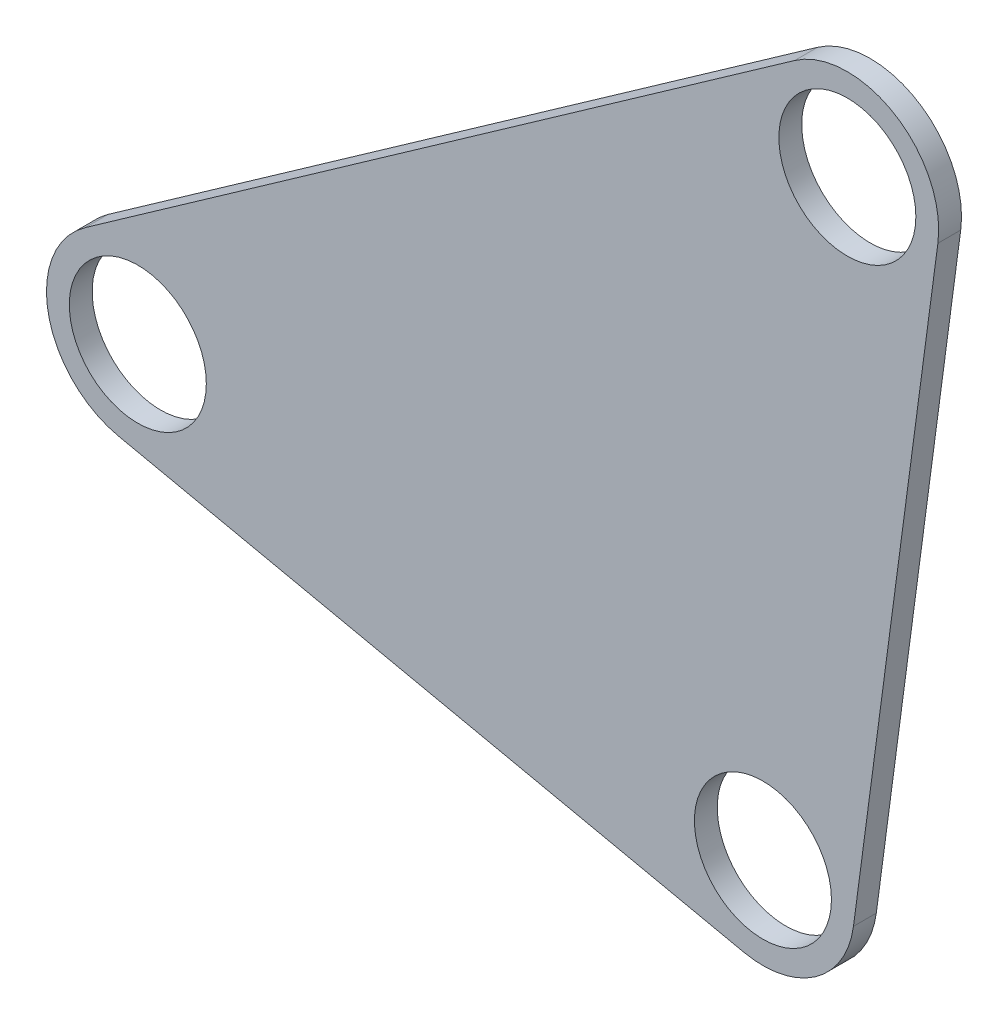
ISO-10303-21;
HEADER;
FILE_DESCRIPTION(('STEP AP214'),'2;1');
FILE_NAME('part.step','',(''),(''),'','','');
FILE_SCHEMA(('AUTOMOTIVE_DESIGN { 1 0 10303 214 1 1 1 1 }'));
ENDSEC;
DATA;
#1=APPLICATION_CONTEXT('core data for automotive mechanical design processes');
#2=APPLICATION_PROTOCOL_DEFINITION('international standard','automotive_design',2000,#1);
#3=PRODUCT_CONTEXT('',#1,'mechanical');
#4=PRODUCT('Part','Part','',(#3));
#5=PRODUCT_RELATED_PRODUCT_CATEGORY('part','',(#4));
#6=PRODUCT_DEFINITION_FORMATION('','',#4);
#7=PRODUCT_DEFINITION_CONTEXT('part definition',#1,'design');
#8=PRODUCT_DEFINITION('design','',#6,#7);
#9=PRODUCT_DEFINITION_SHAPE('','',#8);
#10=(LENGTH_UNIT() NAMED_UNIT(*) SI_UNIT(.MILLI.,.METRE.));
#11=(NAMED_UNIT(*) PLANE_ANGLE_UNIT() SI_UNIT($,.RADIAN.));
#12=(NAMED_UNIT(*) SI_UNIT($,.STERADIAN.) SOLID_ANGLE_UNIT());
#13=UNCERTAINTY_MEASURE_WITH_UNIT(LENGTH_MEASURE(1.E-05),#10,'distance_accuracy_value','');
#14=(GEOMETRIC_REPRESENTATION_CONTEXT(3) GLOBAL_UNCERTAINTY_ASSIGNED_CONTEXT((#13)) GLOBAL_UNIT_ASSIGNED_CONTEXT((#10,
#11,#12)) REPRESENTATION_CONTEXT('',''));
#15=CARTESIAN_POINT('',(0.,0.,0.));
#16=DIRECTION('',(0.,0.,1.));
#17=DIRECTION('',(1.,0.,0.));
#18=AXIS2_PLACEMENT_3D('',#15,#16,#17);
#19=CARTESIAN_POINT('',(-59.1407048004966,0.00999013463617859,1.));
#20=DIRECTION('',(0.,0.,-1.));
#21=DIRECTION('',(-1.,0.,0.));
#22=AXIS2_PLACEMENT_3D('',#19,#20,#21);
#23=PLANE('',#22);
#24=CARTESIAN_POINT('',(-59.1407048004966,0.00999013463617859,1.));
#25=DIRECTION('',(0.,0.,1.));
#26=DIRECTION('',(-1.,0.,0.));
#27=AXIS2_PLACEMENT_3D('',#24,#25,#26);
#28=CIRCLE('',#27,4.);
#29=CARTESIAN_POINT('',(-61.4433059424346,3.28077413562832,1.));
#30=VERTEX_POINT('',#29);
#31=CARTESIAN_POINT('',(-59.9807288881088,-3.90081023513871,1.));
#32=VERTEX_POINT('',#31);
#33=EDGE_CURVE('E137',#30,#32,#28,.T.);
#34=ORIENTED_EDGE('',*,*,#33,.T.);
#35=DIRECTION('',(0.977700092443724,-0.210006021903026,0.));
#36=VECTOR('',#35,1.);
#37=CARTESIAN_POINT('',(-59.9807288881088,-3.90081023513871,1.));
#38=LINE('',#37,#36);
#39=CARTESIAN_POINT('',(-32.6051262996845,-9.78097884842344,1.));
#40=VERTEX_POINT('',#39);
#41=EDGE_CURVE('E95',#32,#40,#38,.T.);
#42=ORIENTED_EDGE('',*,*,#41,.T.);
#43=CARTESIAN_POINT('',(-31.7651022120724,-5.87017847864854,1.));
#44=DIRECTION('',(0.,0.,1.));
#45=DIRECTION('',(1.,0.,0.));
#46=AXIS2_PLACEMENT_3D('',#43,#44,#45);
#47=CIRCLE('',#46,4.);
#48=CARTESIAN_POINT('',(-27.8001194318302,-6.39829925307725,1.));
#49=VERTEX_POINT('',#48);
#50=EDGE_CURVE('E108',#40,#49,#47,.T.);
#51=ORIENTED_EDGE('',*,*,#50,.T.);
#52=DIRECTION('',(0.132030193607178,0.991245695060539,0.));
#53=VECTOR('',#52,1.);
#54=CARTESIAN_POINT('',(-27.8001194318302,-6.39829925307725,1.));
#55=LINE('',#54,#53);
#56=CARTESIAN_POINT('',(-24.1032740108292,21.3565802086178,1.));
#57=VERTEX_POINT('',#56);
#58=EDGE_CURVE('E102',#49,#57,#55,.T.);
#59=ORIENTED_EDGE('',*,*,#58,.T.);
#60=CARTESIAN_POINT('',(-28.0682567910714,21.8847009830465,1.));
#61=DIRECTION('',(0.,0.,1.));
#62=DIRECTION('',(1.,0.,0.));
#63=AXIS2_PLACEMENT_3D('',#60,#61,#62);
#64=CIRCLE('',#63,4.00000000000001);
#65=CARTESIAN_POINT('',(-30.3708579330093,25.1554849840387,1.));
#66=VERTEX_POINT('',#65);
#67=EDGE_CURVE('E106',#57,#66,#64,.T.);
#68=ORIENTED_EDGE('',*,*,#67,.T.);
#69=DIRECTION('',(-0.817696000248033,-0.575650285484485,0.));
#70=VECTOR('',#69,1.);
#71=CARTESIAN_POINT('',(-61.4433059424346,3.28077413562832,1.));
#72=LINE('',#71,#70);
#73=EDGE_CURVE('E58',#66,#30,#72,.T.);
#74=ORIENTED_EDGE('',*,*,#73,.T.);
#75=EDGE_LOOP('',(#34,#42,#51,#59,#68,#74));
#76=FACE_BOUND('',#75,.T.);
#77=CARTESIAN_POINT('',(-28.0682567910714,21.8847009830465,1.));
#78=DIRECTION('',(0.,0.,1.));
#79=DIRECTION('',(1.,0.,0.));
#80=AXIS2_PLACEMENT_3D('',#77,#78,#79);
#81=CIRCLE('',#80,3.);
#82=CARTESIAN_POINT('',(-25.0682567910714,21.8847009830465,1.));
#83=VERTEX_POINT('',#82);
#84=EDGE_CURVE('E130',#83,#83,#81,.T.);
#85=ORIENTED_EDGE('',*,*,#84,.F.);
#86=EDGE_LOOP('',(#85));
#87=FACE_BOUND('',#86,.T.);
#88=CARTESIAN_POINT('',(-31.7651022120724,-5.87017847864854,1.));
#89=DIRECTION('',(0.,0.,1.));
#90=DIRECTION('',(1.,0.,0.));
#91=AXIS2_PLACEMENT_3D('',#88,#89,#90);
#92=CIRCLE('',#91,3.);
#93=CARTESIAN_POINT('',(-28.7651022120724,-5.87017847864854,1.));
#94=VERTEX_POINT('',#93);
#95=EDGE_CURVE('E191',#94,#94,#92,.T.);
#96=ORIENTED_EDGE('',*,*,#95,.F.);
#97=EDGE_LOOP('',(#96));
#98=FACE_BOUND('',#97,.T.);
#99=CARTESIAN_POINT('',(-59.1407048004966,0.00999013463617859,1.));
#100=DIRECTION('',(0.,0.,1.));
#101=DIRECTION('',(1.,0.,0.));
#102=AXIS2_PLACEMENT_3D('',#99,#100,#101);
#103=CIRCLE('',#102,3.);
#104=CARTESIAN_POINT('',(-56.1407048004966,0.00999013463617859,1.));
#105=VERTEX_POINT('',#104);
#106=EDGE_CURVE('E182',#105,#105,#103,.T.);
#107=ORIENTED_EDGE('',*,*,#106,.F.);
#108=EDGE_LOOP('',(#107));
#109=FACE_BOUND('',#108,.T.);
#110=ADVANCED_FACE('F41',(#76,#87,#98,#109),#23,.F.);
#111=CARTESIAN_POINT('',(-59.1407048004966,0.00999013463617859,0.));
#112=DIRECTION('',(0.,0.,-1.));
#113=DIRECTION('',(-1.,0.,0.));
#114=AXIS2_PLACEMENT_3D('',#111,#112,#113);
#115=PLANE('',#114);
#116=CARTESIAN_POINT('',(-31.7651022120724,-5.87017847864854,0.));
#117=DIRECTION('',(0.,0.,1.));
#118=DIRECTION('',(1.,0.,0.));
#119=AXIS2_PLACEMENT_3D('',#116,#117,#118);
#120=CIRCLE('',#119,3.);
#121=CARTESIAN_POINT('',(-28.7651022120724,-5.87017847864854,0.));
#122=VERTEX_POINT('',#121);
#123=EDGE_CURVE('E188',#122,#122,#120,.T.);
#124=ORIENTED_EDGE('',*,*,#123,.T.);
#125=EDGE_LOOP('',(#124));
#126=FACE_BOUND('',#125,.T.);
#127=CARTESIAN_POINT('',(-59.1407048004966,0.00999013463617859,0.));
#128=DIRECTION('',(0.,0.,1.));
#129=DIRECTION('',(-1.,0.,0.));
#130=AXIS2_PLACEMENT_3D('',#127,#128,#129);
#131=CIRCLE('',#130,4.);
#132=CARTESIAN_POINT('',(-61.4433059424346,3.28077413562832,0.));
#133=VERTEX_POINT('',#132);
#134=CARTESIAN_POINT('',(-59.9807288881088,-3.90081023513871,0.));
#135=VERTEX_POINT('',#134);
#136=EDGE_CURVE('E126',#133,#135,#131,.T.);
#137=ORIENTED_EDGE('',*,*,#136,.F.);
#138=DIRECTION('',(-0.817696000248033,-0.575650285484485,0.));
#139=VECTOR('',#138,1.);
#140=CARTESIAN_POINT('',(-61.4433059424346,3.28077413562832,0.));
#141=LINE('',#140,#139);
#142=CARTESIAN_POINT('',(-30.3708579330093,25.1554849840387,0.));
#143=VERTEX_POINT('',#142);
#144=EDGE_CURVE('E87',#143,#133,#141,.T.);
#145=ORIENTED_EDGE('',*,*,#144,.F.);
#146=CARTESIAN_POINT('',(-28.0682567910714,21.8847009830465,0.));
#147=DIRECTION('',(0.,0.,1.));
#148=DIRECTION('',(1.,0.,0.));
#149=AXIS2_PLACEMENT_3D('',#146,#147,#148);
#150=CIRCLE('',#149,4.00000000000001);
#151=CARTESIAN_POINT('',(-24.1032740108292,21.3565802086178,0.));
#152=VERTEX_POINT('',#151);
#153=EDGE_CURVE('E81',#152,#143,#150,.T.);
#154=ORIENTED_EDGE('',*,*,#153,.F.);
#155=DIRECTION('',(0.132030193607178,0.991245695060539,0.));
#156=VECTOR('',#155,1.);
#157=CARTESIAN_POINT('',(-27.8001194318302,-6.39829925307725,0.));
#158=LINE('',#157,#156);
#159=CARTESIAN_POINT('',(-27.8001194318302,-6.39829925307725,0.));
#160=VERTEX_POINT('',#159);
#161=EDGE_CURVE('E116',#160,#152,#158,.T.);
#162=ORIENTED_EDGE('',*,*,#161,.F.);
#163=CARTESIAN_POINT('',(-31.7651022120724,-5.87017847864854,0.));
#164=DIRECTION('',(0.,0.,1.));
#165=DIRECTION('',(1.,0.,0.));
#166=AXIS2_PLACEMENT_3D('',#163,#164,#165);
#167=CIRCLE('',#166,4.);
#168=CARTESIAN_POINT('',(-32.6051262996845,-9.78097884842344,0.));
#169=VERTEX_POINT('',#168);
#170=EDGE_CURVE('E132',#169,#160,#167,.T.);
#171=ORIENTED_EDGE('',*,*,#170,.F.);
#172=DIRECTION('',(0.977700092443724,-0.210006021903026,0.));
#173=VECTOR('',#172,1.);
#174=CARTESIAN_POINT('',(-59.9807288881088,-3.90081023513871,0.));
#175=LINE('',#174,#173);
#176=EDGE_CURVE('E129',#135,#169,#175,.T.);
#177=ORIENTED_EDGE('',*,*,#176,.F.);
#178=EDGE_LOOP('',(#137,#145,#154,#162,#171,#177));
#179=FACE_BOUND('',#178,.T.);
#180=CARTESIAN_POINT('',(-28.0682567910714,21.8847009830465,0.));
#181=DIRECTION('',(0.,0.,1.));
#182=DIRECTION('',(1.,0.,0.));
#183=AXIS2_PLACEMENT_3D('',#180,#181,#182);
#184=CIRCLE('',#183,3.);
#185=CARTESIAN_POINT('',(-25.0682567910714,21.8847009830465,0.));
#186=VERTEX_POINT('',#185);
#187=EDGE_CURVE('E194',#186,#186,#184,.T.);
#188=ORIENTED_EDGE('',*,*,#187,.T.);
#189=EDGE_LOOP('',(#188));
#190=FACE_BOUND('',#189,.T.);
#191=CARTESIAN_POINT('',(-59.1407048004966,0.00999013463617859,0.));
#192=DIRECTION('',(0.,0.,1.));
#193=DIRECTION('',(1.,0.,0.));
#194=AXIS2_PLACEMENT_3D('',#191,#192,#193);
#195=CIRCLE('',#194,3.);
#196=CARTESIAN_POINT('',(-56.1407048004966,0.00999013463617859,0.));
#197=VERTEX_POINT('',#196);
#198=EDGE_CURVE('E185',#197,#197,#195,.T.);
#199=ORIENTED_EDGE('',*,*,#198,.T.);
#200=EDGE_LOOP('',(#199));
#201=FACE_BOUND('',#200,.T.);
#202=ADVANCED_FACE('F146',(#126,#179,#190,#201),#115,.T.);
#203=CARTESIAN_POINT('',(-59.1407048004966,0.00999013463617859,1.));
#204=DIRECTION('',(0.,0.,-1.));
#205=DIRECTION('',(-1.,0.,0.));
#206=AXIS2_PLACEMENT_3D('',#203,#204,#205);
#207=CYLINDRICAL_SURFACE('',#206,4.);
#208=ORIENTED_EDGE('',*,*,#136,.T.);
#209=DIRECTION('',(0.,0.,-1.));
#210=VECTOR('',#209,1.);
#211=CARTESIAN_POINT('',(-59.9807288881088,-3.90081023513871,1.));
#212=LINE('',#211,#210);
#213=EDGE_CURVE('E11',#32,#135,#212,.T.);
#214=ORIENTED_EDGE('',*,*,#213,.F.);
#215=ORIENTED_EDGE('',*,*,#33,.F.);
#216=DIRECTION('',(0.,0.,-1.));
#217=VECTOR('',#216,1.);
#218=CARTESIAN_POINT('',(-61.4433059424346,3.28077413562832,1.));
#219=LINE('',#218,#217);
#220=EDGE_CURVE('E122',#30,#133,#219,.T.);
#221=ORIENTED_EDGE('',*,*,#220,.T.);
#222=EDGE_LOOP('',(#208,#214,#215,#221));
#223=FACE_BOUND('',#222,.T.);
#224=ADVANCED_FACE('F43',(#223),#207,.T.);
#225=CARTESIAN_POINT('',(-59.9807288881088,-3.90081023513871,1.));
#226=DIRECTION('',(0.210006021903026,0.977700092443724,0.));
#227=DIRECTION('',(-0.977700092443724,0.210006021903026,0.));
#228=AXIS2_PLACEMENT_3D('',#225,#226,#227);
#229=PLANE('',#228);
#230=ORIENTED_EDGE('',*,*,#176,.T.);
#231=DIRECTION('',(0.,0.,-1.));
#232=VECTOR('',#231,1.);
#233=CARTESIAN_POINT('',(-32.6051262996845,-9.78097884842344,1.));
#234=LINE('',#233,#232);
#235=EDGE_CURVE('E50',#40,#169,#234,.T.);
#236=ORIENTED_EDGE('',*,*,#235,.F.);
#237=ORIENTED_EDGE('',*,*,#41,.F.);
#238=ORIENTED_EDGE('',*,*,#213,.T.);
#239=EDGE_LOOP('',(#230,#236,#237,#238));
#240=FACE_BOUND('',#239,.T.);
#241=ADVANCED_FACE('F249',(#240),#229,.F.);
#242=CARTESIAN_POINT('',(-31.7651022120724,-5.87017847864854,1.));
#243=DIRECTION('',(0.,0.,-1.));
#244=DIRECTION('',(-1.,0.,0.));
#245=AXIS2_PLACEMENT_3D('',#242,#243,#244);
#246=CYLINDRICAL_SURFACE('',#245,4.);
#247=ORIENTED_EDGE('',*,*,#170,.T.);
#248=DIRECTION('',(0.,0.,-1.));
#249=VECTOR('',#248,1.);
#250=CARTESIAN_POINT('',(-27.8001194318302,-6.39829925307725,1.));
#251=LINE('',#250,#249);
#252=EDGE_CURVE('E117',#49,#160,#251,.T.);
#253=ORIENTED_EDGE('',*,*,#252,.F.);
#254=ORIENTED_EDGE('',*,*,#50,.F.);
#255=ORIENTED_EDGE('',*,*,#235,.T.);
#256=EDGE_LOOP('',(#247,#253,#254,#255));
#257=FACE_BOUND('',#256,.T.);
#258=ADVANCED_FACE('F143',(#257),#246,.T.);
#259=CARTESIAN_POINT('',(-27.8001194318302,-6.39829925307725,1.));
#260=DIRECTION('',(-0.991245695060539,0.132030193607178,0.));
#261=DIRECTION('',(-0.132030193607178,-0.991245695060539,0.));
#262=AXIS2_PLACEMENT_3D('',#259,#260,#261);
#263=PLANE('',#262);
#264=ORIENTED_EDGE('',*,*,#161,.T.);
#265=DIRECTION('',(0.,0.,-1.));
#266=VECTOR('',#265,1.);
#267=CARTESIAN_POINT('',(-24.1032740108292,21.3565802086178,1.));
#268=LINE('',#267,#266);
#269=EDGE_CURVE('E113',#57,#152,#268,.T.);
#270=ORIENTED_EDGE('',*,*,#269,.F.);
#271=ORIENTED_EDGE('',*,*,#58,.F.);
#272=ORIENTED_EDGE('',*,*,#252,.T.);
#273=EDGE_LOOP('',(#264,#270,#271,#272));
#274=FACE_BOUND('',#273,.T.);
#275=ADVANCED_FACE('F114',(#274),#263,.F.);
#276=CARTESIAN_POINT('',(-28.0682567910714,21.8847009830465,1.));
#277=DIRECTION('',(0.,0.,-1.));
#278=DIRECTION('',(-1.,0.,0.));
#279=AXIS2_PLACEMENT_3D('',#276,#277,#278);
#280=CYLINDRICAL_SURFACE('',#279,4.00000000000001);
#281=ORIENTED_EDGE('',*,*,#153,.T.);
#282=DIRECTION('',(0.,0.,-1.));
#283=VECTOR('',#282,1.);
#284=CARTESIAN_POINT('',(-30.3708579330093,25.1554849840387,1.));
#285=LINE('',#284,#283);
#286=EDGE_CURVE('E118',#66,#143,#285,.T.);
#287=ORIENTED_EDGE('',*,*,#286,.F.);
#288=ORIENTED_EDGE('',*,*,#67,.F.);
#289=ORIENTED_EDGE('',*,*,#269,.T.);
#290=EDGE_LOOP('',(#281,#287,#288,#289));
#291=FACE_BOUND('',#290,.T.);
#292=ADVANCED_FACE('F120',(#291),#280,.T.);
#293=CARTESIAN_POINT('',(-61.4433059424346,3.28077413562832,1.));
#294=DIRECTION('',(0.575650285484485,-0.817696000248033,0.));
#295=DIRECTION('',(0.817696000248033,0.575650285484485,0.));
#296=AXIS2_PLACEMENT_3D('',#293,#294,#295);
#297=PLANE('',#296);
#298=ORIENTED_EDGE('',*,*,#144,.T.);
#299=ORIENTED_EDGE('',*,*,#220,.F.);
#300=ORIENTED_EDGE('',*,*,#73,.F.);
#301=ORIENTED_EDGE('',*,*,#286,.T.);
#302=EDGE_LOOP('',(#298,#299,#300,#301));
#303=FACE_BOUND('',#302,.T.);
#304=ADVANCED_FACE('F151',(#303),#297,.F.);
#305=CARTESIAN_POINT('',(-28.0682567910714,21.8847009830465,1.));
#306=DIRECTION('',(0.,0.,-1.));
#307=DIRECTION('',(-1.,0.,0.));
#308=AXIS2_PLACEMENT_3D('',#305,#306,#307);
#309=CYLINDRICAL_SURFACE('',#308,3.);
#310=ORIENTED_EDGE('',*,*,#84,.T.);
#311=EDGE_LOOP('',(#310));
#312=FACE_BOUND('',#311,.T.);
#313=ORIENTED_EDGE('',*,*,#187,.F.);
#314=EDGE_LOOP('',(#313));
#315=FACE_BOUND('',#314,.T.);
#316=ADVANCED_FACE('F153',(#312,#315),#309,.F.);
#317=CARTESIAN_POINT('',(-31.7651022120724,-5.87017847864854,1.));
#318=DIRECTION('',(0.,0.,-1.));
#319=DIRECTION('',(-1.,0.,0.));
#320=AXIS2_PLACEMENT_3D('',#317,#318,#319);
#321=CYLINDRICAL_SURFACE('',#320,3.);
#322=ORIENTED_EDGE('',*,*,#95,.T.);
#323=EDGE_LOOP('',(#322));
#324=FACE_BOUND('',#323,.T.);
#325=ORIENTED_EDGE('',*,*,#123,.F.);
#326=EDGE_LOOP('',(#325));
#327=FACE_BOUND('',#326,.T.);
#328=ADVANCED_FACE('F159',(#324,#327),#321,.F.);
#329=CARTESIAN_POINT('',(-59.1407048004966,0.00999013463617859,1.));
#330=DIRECTION('',(0.,0.,-1.));
#331=DIRECTION('',(-1.,0.,0.));
#332=AXIS2_PLACEMENT_3D('',#329,#330,#331);
#333=CYLINDRICAL_SURFACE('',#332,3.);
#334=ORIENTED_EDGE('',*,*,#106,.T.);
#335=EDGE_LOOP('',(#334));
#336=FACE_BOUND('',#335,.T.);
#337=ORIENTED_EDGE('',*,*,#198,.F.);
#338=EDGE_LOOP('',(#337));
#339=FACE_BOUND('',#338,.T.);
#340=ADVANCED_FACE('F173',(#336,#339),#333,.F.);
#341=CLOSED_SHELL('',(#110,#202,#224,#241,#258,#275,#292,#304,#316,#328,#340));
#342=MANIFOLD_SOLID_BREP('B2',#341);
#343=ADVANCED_BREP_SHAPE_REPRESENTATION('',(#18,#342),#14);
#344=SHAPE_DEFINITION_REPRESENTATION(#9,#343);
ENDSEC;
END-ISO-10303-21;
